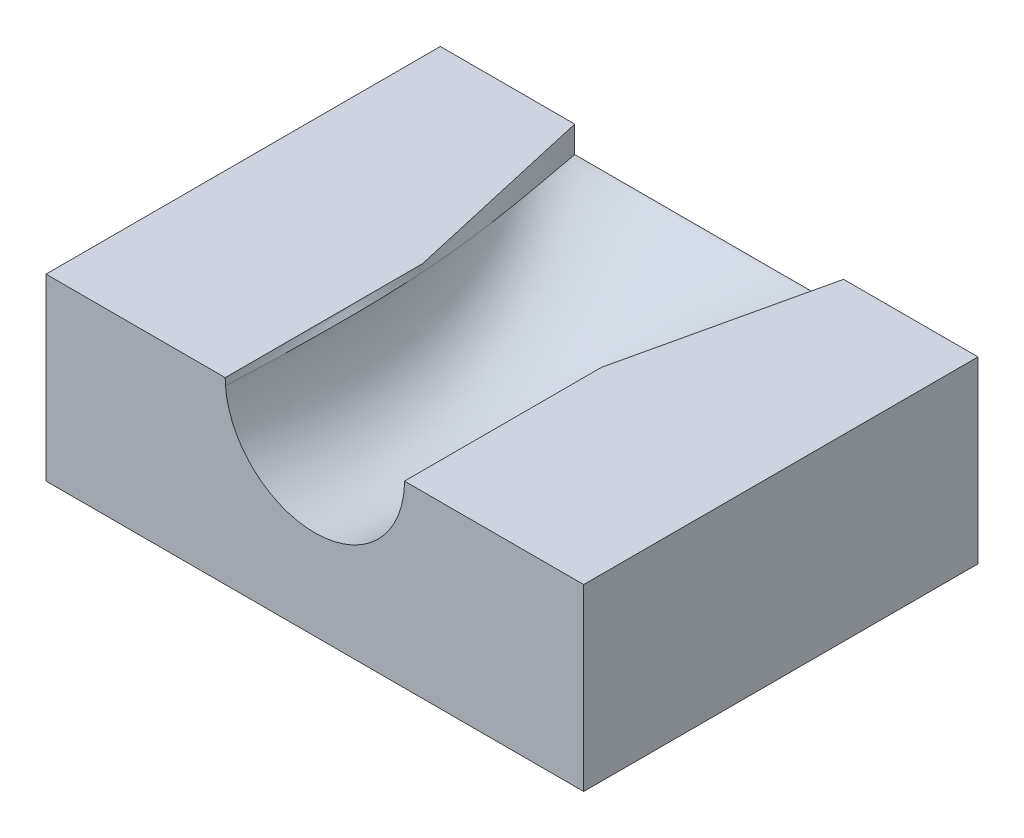
ISO-10303-21;
HEADER;
FILE_DESCRIPTION(('STEP AP214'),'2;1');
FILE_NAME('part.step','',(''),(''),'','','');
FILE_SCHEMA(('AUTOMOTIVE_DESIGN { 1 0 10303 214 1 1 1 1 }'));
ENDSEC;
DATA;
#1=APPLICATION_CONTEXT('core data for automotive mechanical design processes');
#2=APPLICATION_PROTOCOL_DEFINITION('international standard','automotive_design',2000,#1);
#3=PRODUCT_CONTEXT('',#1,'mechanical');
#4=PRODUCT('Part','Part','',(#3));
#5=PRODUCT_RELATED_PRODUCT_CATEGORY('part','',(#4));
#6=PRODUCT_DEFINITION_FORMATION('','',#4);
#7=PRODUCT_DEFINITION_CONTEXT('part definition',#1,'design');
#8=PRODUCT_DEFINITION('design','',#6,#7);
#9=PRODUCT_DEFINITION_SHAPE('','',#8);
#10=(LENGTH_UNIT() NAMED_UNIT(*) SI_UNIT(.MILLI.,.METRE.));
#11=(NAMED_UNIT(*) PLANE_ANGLE_UNIT() SI_UNIT($,.RADIAN.));
#12=(NAMED_UNIT(*) SI_UNIT($,.STERADIAN.) SOLID_ANGLE_UNIT());
#13=UNCERTAINTY_MEASURE_WITH_UNIT(LENGTH_MEASURE(1.E-05),#10,'distance_accuracy_value','');
#14=(GEOMETRIC_REPRESENTATION_CONTEXT(3) GLOBAL_UNCERTAINTY_ASSIGNED_CONTEXT((#13)) GLOBAL_UNIT_ASSIGNED_CONTEXT((#10,
#11,#12)) REPRESENTATION_CONTEXT('',''));
#15=CARTESIAN_POINT('',(0.,0.,0.));
#16=DIRECTION('',(0.,0.,1.));
#17=DIRECTION('',(1.,0.,0.));
#18=AXIS2_PLACEMENT_3D('',#15,#16,#17);
#19=CARTESIAN_POINT('',(-25.4,-25.4,27.94));
#20=DIRECTION('',(0.,0.,1.));
#21=DIRECTION('',(1.,0.,0.));
#22=AXIS2_PLACEMENT_3D('',#19,#20,#21);
#23=PLANE('',#22);
#24=DIRECTION('',(0.,-1.,0.));
#25=VECTOR('',#24,1.);
#26=CARTESIAN_POINT('',(-25.4,0.,27.94));
#27=LINE('',#26,#25);
#28=CARTESIAN_POINT('',(-25.4,0.,27.94));
#29=VERTEX_POINT('',#28);
#30=CARTESIAN_POINT('',(-25.4,-25.4,27.94));
#31=VERTEX_POINT('',#30);
#32=EDGE_CURVE('E171',#29,#31,#27,.T.);
#33=ORIENTED_EDGE('',*,*,#32,.F.);
#34=DIRECTION('',(-1.,0.,0.));
#35=VECTOR('',#34,1.);
#36=CARTESIAN_POINT('',(-25.4,0.,27.94));
#37=LINE('',#36,#35);
#38=CARTESIAN_POINT('',(-6.35,0.,27.94));
#39=VERTEX_POINT('',#38);
#40=EDGE_CURVE('E252',#39,#29,#37,.T.);
#41=ORIENTED_EDGE('',*,*,#40,.F.);
#42=DIRECTION('',(0.,1.,0.));
#43=VECTOR('',#42,1.);
#44=CARTESIAN_POINT('',(-6.35,0.,27.94));
#45=LINE('',#44,#43);
#46=CARTESIAN_POINT('',(-6.35,-3.73783334356403,27.94));
#47=VERTEX_POINT('',#46);
#48=EDGE_CURVE('E495',#47,#39,#45,.T.);
#49=ORIENTED_EDGE('',*,*,#48,.F.);
#50=DIRECTION('',(-1.,0.,0.));
#51=VECTOR('',#50,1.);
#52=CARTESIAN_POINT('',(-6.35,-3.73783334356403,27.94));
#53=LINE('',#52,#51);
#54=CARTESIAN_POINT('',(31.75,-3.73783334356403,27.94));
#55=VERTEX_POINT('',#54);
#56=EDGE_CURVE('E352',#55,#47,#53,.T.);
#57=ORIENTED_EDGE('',*,*,#56,.F.);
#58=DIRECTION('',(0.,-1.,0.));
#59=VECTOR('',#58,1.);
#60=CARTESIAN_POINT('',(31.75,-3.73783334356403,27.94));
#61=LINE('',#60,#59);
#62=CARTESIAN_POINT('',(31.75,0.,27.94));
#63=VERTEX_POINT('',#62);
#64=EDGE_CURVE('E366',#63,#55,#61,.T.);
#65=ORIENTED_EDGE('',*,*,#64,.F.);
#66=DIRECTION('',(-1.,0.,0.));
#67=VECTOR('',#66,1.);
#68=CARTESIAN_POINT('',(31.75,0.,27.94));
#69=LINE('',#68,#67);
#70=CARTESIAN_POINT('',(50.8,0.,27.94));
#71=VERTEX_POINT('',#70);
#72=EDGE_CURVE('E528',#71,#63,#69,.T.);
#73=ORIENTED_EDGE('',*,*,#72,.F.);
#74=DIRECTION('',(0.,1.,0.));
#75=VECTOR('',#74,1.);
#76=CARTESIAN_POINT('',(50.8,-25.4,27.94));
#77=LINE('',#76,#75);
#78=CARTESIAN_POINT('',(50.8,-25.4,27.94));
#79=VERTEX_POINT('',#78);
#80=EDGE_CURVE('E164',#79,#71,#77,.T.);
#81=ORIENTED_EDGE('',*,*,#80,.F.);
#82=DIRECTION('',(1.,0.,0.));
#83=VECTOR('',#82,1.);
#84=CARTESIAN_POINT('',(-25.4,-25.4,27.94));
#85=LINE('',#84,#83);
#86=EDGE_CURVE('E168',#31,#79,#85,.T.);
#87=ORIENTED_EDGE('',*,*,#86,.F.);
#88=EDGE_LOOP('',(#33,#41,#49,#57,#65,#73,#81,#87));
#89=FACE_BOUND('',#88,.T.);
#90=ADVANCED_FACE('F111',(#89),#23,.F.);
#91=CARTESIAN_POINT('',(12.7,0.,83.82));
#92=DIRECTION('',(0.,0.,1.));
#93=DIRECTION('',(1.,0.,0.));
#94=AXIS2_PLACEMENT_3D('',#91,#92,#93);
#95=PLANE('',#94);
#96=CARTESIAN_POINT('',(12.7,0.,83.82));
#97=DIRECTION('',(0.,0.,-1.));
#98=DIRECTION('',(1.,0.,0.));
#99=AXIS2_PLACEMENT_3D('',#96,#97,#98);
#100=CIRCLE('',#99,12.7);
#101=CARTESIAN_POINT('',(25.4,0.,83.82));
#102=VERTEX_POINT('',#101);
#103=CARTESIAN_POINT('',(25.2436419255583,-1.98671770601093,83.82));
#104=VERTEX_POINT('',#103);
#105=EDGE_CURVE('E131',#102,#104,#100,.T.);
#106=ORIENTED_EDGE('',*,*,#105,.T.);
#107=CARTESIAN_POINT('',(0.0391498615892744,-0.996430515743631,83.82));
#108=VERTEX_POINT('',#107);
#109=EDGE_CURVE('E469',#104,#108,#100,.T.);
#110=ORIENTED_EDGE('',*,*,#109,.T.);
#111=CARTESIAN_POINT('',(0.,0.,83.82));
#112=VERTEX_POINT('',#111);
#113=EDGE_CURVE('E309',#108,#112,#100,.T.);
#114=ORIENTED_EDGE('',*,*,#113,.T.);
#115=DIRECTION('',(-1.,0.,0.));
#116=VECTOR('',#115,1.);
#117=CARTESIAN_POINT('',(0.,0.,83.82));
#118=LINE('',#117,#116);
#119=CARTESIAN_POINT('',(-25.4,0.,83.82));
#120=VERTEX_POINT('',#119);
#121=EDGE_CURVE('E13',#112,#120,#118,.T.);
#122=ORIENTED_EDGE('',*,*,#121,.T.);
#123=DIRECTION('',(0.,-1.,0.));
#124=VECTOR('',#123,1.);
#125=CARTESIAN_POINT('',(-25.4,0.,83.82));
#126=LINE('',#125,#124);
#127=CARTESIAN_POINT('',(-25.4,-25.4,83.82));
#128=VERTEX_POINT('',#127);
#129=EDGE_CURVE('E122',#120,#128,#126,.T.);
#130=ORIENTED_EDGE('',*,*,#129,.T.);
#131=DIRECTION('',(1.,0.,0.));
#132=VECTOR('',#131,1.);
#133=CARTESIAN_POINT('',(-25.4,-25.4,83.82));
#134=LINE('',#133,#132);
#135=CARTESIAN_POINT('',(50.8,-25.4,83.82));
#136=VERTEX_POINT('',#135);
#137=EDGE_CURVE('E199',#128,#136,#134,.T.);
#138=ORIENTED_EDGE('',*,*,#137,.T.);
#139=DIRECTION('',(0.,1.,0.));
#140=VECTOR('',#139,1.);
#141=CARTESIAN_POINT('',(50.8,-25.4,83.82));
#142=LINE('',#141,#140);
#143=CARTESIAN_POINT('',(50.8,0.,83.82));
#144=VERTEX_POINT('',#143);
#145=EDGE_CURVE('E429',#136,#144,#142,.T.);
#146=ORIENTED_EDGE('',*,*,#145,.T.);
#147=DIRECTION('',(-1.,0.,0.));
#148=VECTOR('',#147,1.);
#149=CARTESIAN_POINT('',(50.8,0.,83.82));
#150=LINE('',#149,#148);
#151=EDGE_CURVE('E415',#144,#102,#150,.T.);
#152=ORIENTED_EDGE('',*,*,#151,.T.);
#153=EDGE_LOOP('',(#106,#110,#114,#122,#130,#138,#146,#152));
#154=FACE_BOUND('',#153,.T.);
#155=ADVANCED_FACE('F329',(#154),#95,.T.);
#156=CARTESIAN_POINT('',(25.2436419255583,-1.98671770601093,83.82));
#157=CARTESIAN_POINT('',(24.7217942455111,-1.84626806851848,74.4532548870848));
#158=CARTESIAN_POINT('',(24.1999465654639,-1.70581843102602,65.0865097741695));
#159=CARTESIAN_POINT('',(25.2428046432121,-1.98649236055766,55.8873789835776));
#160=CARTESIAN_POINT('',(25.2432231584177,-1.98660499938151,55.8836894779942));
#161=CARTESIAN_POINT('',(26.3143823083008,-2.27489585521936,46.4464205784919));
#162=CARTESIAN_POINT('',(29.0321911541504,-3.0063645993917,37.1932102892459));
#163=CARTESIAN_POINT('',(31.75,-3.73783334356403,27.94));
#164=CARTESIAN_POINT('',(25.2696479995084,-1.82252181721763,83.82));
#165=CARTESIAN_POINT('',(24.7925928230331,-1.69388571048627,74.4577058687166));
#166=CARTESIAN_POINT('',(24.3155376465579,-1.56524960375491,65.0954117374331));
#167=CARTESIAN_POINT('',(25.2689513371596,-1.82231542607063,55.886460649473));
#168=CARTESIAN_POINT('',(25.2694033178852,-1.82241859059298,55.8827751838818));
#169=CARTESIAN_POINT('',(26.4261081826934,-2.08646066263625,46.4558342482269));
#170=CARTESIAN_POINT('',(29.0880540913467,-2.75640394711831,37.1979171241135));
#171=CARTESIAN_POINT('',(31.75,-3.42634723160037,27.94));
#172=CARTESIAN_POINT('',(25.3152114436737,-1.49310867031271,83.82));
#173=CARTESIAN_POINT('',(24.9272240508749,-1.38801770535624,74.4666078319802));
#174=CARTESIAN_POINT('',(24.5392366580761,-1.28292674039977,65.1132156639604));
#175=CARTESIAN_POINT('',(25.3147951914567,-1.4929400563415,55.8846239812638));
#176=CARTESIAN_POINT('',(25.3153145180289,-1.49302433795946,55.880946595657));
#177=CARTESIAN_POINT('',(26.6441724800492,-1.70873699317905,46.4746615876969));
#178=CARTESIAN_POINT('',(29.1970862400246,-2.25605600042604,37.2073307938485));
#179=CARTESIAN_POINT('',(31.75,-2.80337500767303,27.94));
#180=CARTESIAN_POINT('',(25.3641046689634,-0.996686652853036,83.82));
#181=CARTESIAN_POINT('',(25.1081587931166,-0.926728742968917,74.4799607768758));
#182=CARTESIAN_POINT('',(24.8522129172698,-0.856770833084798,65.1399215537514));
#183=CARTESIAN_POINT('',(25.3641065287362,-0.996574408370288,55.8818689789502));
#184=CARTESIAN_POINT('',(25.3647281253055,-0.996630513724697,55.8782037133199));
#185=CARTESIAN_POINT('',(26.9550181582644,-1.14022807704488,46.5029025969021));
#186=CARTESIAN_POINT('',(29.3525090791322,-1.50457237441345,37.221451298451));
#187=CARTESIAN_POINT('',(31.75,-1.86891667178202,27.94));
#188=CARTESIAN_POINT('',(25.3934709131461,-0.498727828651121,83.82));
#189=CARTESIAN_POINT('',(25.2680003770333,-0.463779713019099,74.4933137217712));
#190=CARTESIAN_POINT('',(25.1425298409205,-0.428831597387077,65.1666274435424));
#191=CARTESIAN_POINT('',(25.3938883720443,-0.498671755890102,55.8791139766365));
#192=CARTESIAN_POINT('',(25.3946134946651,-0.498699783834572,55.8754608309827));
#193=CARTESIAN_POINT('',(27.2495503777436,-0.570435263863964,46.5311436061072));
#194=CARTESIAN_POINT('',(29.4997751888718,-0.752446799877487,37.2355718030536));
#195=CARTESIAN_POINT('',(31.75,-0.934458335891011,27.94));
#196=CARTESIAN_POINT('',(25.4,-0.166242611200983,83.82));
#197=CARTESIAN_POINT('',(25.3604664655544,-0.15459323945603,74.5022156850349));
#198=CARTESIAN_POINT('',(25.3209329311087,-0.142943867711078,65.1844313700696));
#199=CARTESIAN_POINT('',(25.4006928458237,-0.166223920280855,55.8772773084273));
#200=CARTESIAN_POINT('',(25.4014878251384,-0.166233262928906,55.8736322427579));
#201=CARTESIAN_POINT('',(27.4350041361835,-0.190145089333625,46.5499709455772));
#202=CARTESIAN_POINT('',(29.5925020680918,-0.250815600648648,37.2449854727886));
#203=CARTESIAN_POINT('',(31.75,-0.31148611196367,27.94));
#204=CARTESIAN_POINT('',(25.4,0.,83.82));
#205=CARTESIAN_POINT('',(25.4031731310579,0.,74.5066666666667));
#206=CARTESIAN_POINT('',(25.4063462621159,0.,65.1933333333333));
#207=CARTESIAN_POINT('',(25.4008301191829,0.,55.8763589743228));
#208=CARTESIAN_POINT('',(25.4016602368332,0.,55.8727179486456));
#209=CARTESIAN_POINT('',(27.5250037123864,0.,46.5593846153123));
#210=CARTESIAN_POINT('',(29.6375018561932,0.,37.2496923076561));
#211=CARTESIAN_POINT('',(31.75,0.,27.94));
#212=B_SPLINE_SURFACE_WITH_KNOTS('',3,3,((#156,#157,#158,#159,#160,#161,#162,#163),(#164,#165,
#166,#167,#168,#169,#170,#171),(#172,#173,#174,#175,#176,#177,#178,#179),(#180,#181,#182,#183,
#184,#185,#186,#187),(#188,#189,#190,#191,#192,#193,#194,#195),(#196,#197,#198,#199,#200,#201,
#202,#203),(#204,#205,#206,#207,#208,#209,#210,#211)),.UNSPECIFIED.,.F.,.F.,.F.,(4,1,1,1,4),(4,
2,2,4),(0.938118294418709,0.953588720814032,0.969059147209355,0.984529573604677,1.),(0.,
0.493506931644914,0.493704943914121,1.),.UNSPECIFIED.);
#213=CARTESIAN_POINT('',(25.4,0.,83.82));
#214=CARTESIAN_POINT('',(25.4031731310579,0.,74.5066666666667));
#215=CARTESIAN_POINT('',(25.4063462621159,0.,65.1933333333333));
#216=CARTESIAN_POINT('',(25.4008301191829,0.,55.8763589743228));
#217=CARTESIAN_POINT('',(25.4016602368332,0.,55.8727179486456));
#218=CARTESIAN_POINT('',(27.5250037123864,0.,46.5593846153123));
#219=CARTESIAN_POINT('',(29.6375018561932,0.,37.2496923076561));
#220=CARTESIAN_POINT('',(31.75,0.,27.94));
#221=B_SPLINE_CURVE_WITH_KNOTS('',3,(#213,#214,#215,#216,#217,#218,#219,#220),.UNSPECIFIED.,.F.,
.F.,(4,2,2,4),(0.,0.493506931644914,0.493704943914121,1.),.UNSPECIFIED.);
#222=EDGE_CURVE('E394',#102,#63,#221,.T.);
#223=CARTESIAN_POINT('',(25.2436419255583,-1.98671770601093,83.82));
#224=CARTESIAN_POINT('',(24.7217942455111,-1.84626806851848,74.4532548870848));
#225=CARTESIAN_POINT('',(24.1999465654639,-1.70581843102602,65.0865097741695));
#226=CARTESIAN_POINT('',(25.2428046432121,-1.98649236055766,55.8873789835776));
#227=CARTESIAN_POINT('',(25.2432231584177,-1.98660499938151,55.8836894779942));
#228=CARTESIAN_POINT('',(26.3143823083008,-2.27489585521936,46.4464205784919));
#229=CARTESIAN_POINT('',(29.0321911541504,-3.0063645993917,37.1932102892459));
#230=CARTESIAN_POINT('',(31.75,-3.73783334356403,27.94));
#231=B_SPLINE_CURVE_WITH_KNOTS('',3,(#223,#224,#225,#226,#227,#228,#229,#230),.UNSPECIFIED.,.F.,
.F.,(4,2,2,4),(0.,0.493506931644914,0.493704943914121,1.),.UNSPECIFIED.);
#232=EDGE_CURVE('E401',#104,#55,#231,.T.);
#233=ORIENTED_EDGE('',*,*,#105,.F.);
#234=ORIENTED_EDGE('',*,*,#222,.T.);
#235=ORIENTED_EDGE('',*,*,#64,.T.);
#236=ORIENTED_EDGE('',*,*,#232,.F.);
#237=EDGE_LOOP('',(#233,#234,#235,#236));
#238=FACE_BOUND('',#237,.T.);
#239=ADVANCED_FACE('F372',(#238),#212,.T.);
#240=CARTESIAN_POINT('',(0.0391498615892744,-0.996430515743631,83.82));
#241=CARTESIAN_POINT('',(0.551596762696879,-0.776554098029622,74.4532548870848));
#242=CARTESIAN_POINT('',(1.06404366380448,-0.556677680315613,65.0865097741695));
#243=CARTESIAN_POINT('',(0.0399720607865443,-0.996077733409003,55.8873789835776));
#244=CARTESIAN_POINT('',(0.0395610848861714,-0.996254071500902,55.8836894779942));
#245=CARTESIAN_POINT('',(-1.01230176310234,-1.44757855886199,46.4464205784919));
#246=CARTESIAN_POINT('',(-3.68115088155117,-2.59270595121301,37.1932102892459));
#247=CARTESIAN_POINT('',(-6.35,-3.73783334356403,27.94));
#248=CARTESIAN_POINT('',(0.159799876275896,-2.52943430377433,83.82));
#249=CARTESIAN_POINT('',(0.554596895059939,-2.43251368731416,74.4532548870848));
#250=CARTESIAN_POINT('',(0.949393913843982,-2.33559307085399,65.0865097741695));
#251=CARTESIAN_POINT('',(0.160433311254675,-2.52927879877883,55.8873789835776));
#252=CARTESIAN_POINT('',(0.16011668906434,-2.52935652788115,55.8836894779942));
#253=CARTESIAN_POINT('',(-0.650254718505863,-2.72829849716275,46.4464205784919));
#254=CARTESIAN_POINT('',(-2.70637735925293,-3.23306592036339,37.1932102892459));
#255=CARTESIAN_POINT('',(-4.7625,-3.73783334356403,27.94));
#256=CARTESIAN_POINT('',(0.963484239614055,-5.5508265044219,83.8200000000003));
#257=CARTESIAN_POINT('',(1.16808798137688,-5.6962390784165,74.4532548870849));
#258=CARTESIAN_POINT('',(1.37269172313971,-5.84165165241109,65.0865097741695));
#259=CARTESIAN_POINT('',(0.963812517591503,-5.55105981269512,55.8873789835775));
#260=CARTESIAN_POINT('',(0.963648427991568,-5.55094319365928,55.8836894779942));
#261=CARTESIAN_POINT('',(0.543673062632586,-5.25246527548923,46.4464205784918));
#262=CARTESIAN_POINT('',(-0.521913468683705,-4.49514930952663,37.1932102892459));
#263=CARTESIAN_POINT('',(-1.5875,-3.73783334356404,27.94));
#264=CARTESIAN_POINT('',(3.70199935855768,-9.35865154536493,83.8199999999996));
#265=CARTESIAN_POINT('',(3.74426776578381,-9.80947378801077,74.4532548870845));
#266=CARTESIAN_POINT('',(3.78653617300995,-10.2602960306566,65.0865097741695));
#267=CARTESIAN_POINT('',(3.70206717641432,-9.35937487042594,55.8873789835776));
#268=CARTESIAN_POINT('',(3.70203327768905,-9.35901331671827,55.8836894779942));
#269=CARTESIAN_POINT('',(3.61527196230448,-8.43364296700772,46.446420578492));
#270=CARTESIAN_POINT('',(3.39513598115224,-6.08573815528588,37.193210289246));
#271=CARTESIAN_POINT('',(3.17500000000001,-3.73783334356404,27.94));
#272=CARTESIAN_POINT('',(7.61417757813304,-11.9450890017901,83.8200000000004));
#273=CARTESIAN_POINT('',(7.58824524335711,-12.6033585399551,74.4532548870849));
#274=CARTESIAN_POINT('',(7.56231290858119,-13.2616280781202,65.0865097741695));
#275=CARTESIAN_POINT('',(7.6141359708079,-11.9461451671893,55.8873789835775));
#276=CARTESIAN_POINT('',(7.61415676821074,-11.9456172433877,55.8836894779941));
#277=CARTESIAN_POINT('',(7.66738620418439,-10.5944347703123,46.4464205784918));
#278=CARTESIAN_POINT('',(7.8024431020922,-7.16613405693816,37.1932102892459));
#279=CARTESIAN_POINT('',(7.93750000000001,-3.73783334356403,27.94));
#280=CARTESIAN_POINT('',(12.19030144725,-12.9726944406285,83.8199999999999));
#281=CARTESIAN_POINT('',(12.1494206650623,-13.7133838991432,74.4532548870847));
#282=CARTESIAN_POINT('',(12.1085398828747,-14.4540733576579,65.0865097741695));
#283=CARTESIAN_POINT('',(12.1902358557784,-12.9738828452747,55.8873789835777));
#284=CARTESIAN_POINT('',(12.1902686416461,-12.9732888217447,55.8836894779943));
#285=CARTESIAN_POINT('',(12.2741816790494,-11.4529289139682,46.446420578492));
#286=CARTESIAN_POINT('',(12.4870908395247,-7.59538112876609,37.193210289246));
#287=CARTESIAN_POINT('',(12.7,-3.73783334356403,27.94));
#288=CARTESIAN_POINT('',(16.8329436471787,-12.3072953071215,83.82));
#289=CARTESIAN_POINT('',(16.7824495737785,-12.9946158931959,74.4532548870847));
#290=CARTESIAN_POINT('',(16.7319555003783,-13.6819364792703,65.0865097741693));
#291=CARTESIAN_POINT('',(16.8328626315915,-12.3083980836881,55.8873789835774));
#292=CARTESIAN_POINT('',(16.8329031271964,-12.3078468613154,55.883689477994));
#293=CARTESIAN_POINT('',(16.9365486751322,-10.8970333944241,46.4464205784917));
#294=CARTESIAN_POINT('',(17.1995243375661,-7.31743336899407,37.1932102892459));
#295=CARTESIAN_POINT('',(17.4625,-3.73783334356403,27.94));
#296=CARTESIAN_POINT('',(20.9359914709144,-10.0357769396288,83.8199999999998));
#297=CARTESIAN_POINT('',(20.8326055055605,-10.5409085688861,74.4532548870848));
#298=CARTESIAN_POINT('',(20.7292195402066,-11.0460401981434,65.0865097741696));
#299=CARTESIAN_POINT('',(20.9358255925423,-10.0365874017843,55.8873789835778));
#300=CARTESIAN_POINT('',(20.9359085067723,-10.036182292639,55.8836894779944));
#301=CARTESIAN_POINT('',(21.1481214321001,-8.99933497633891,46.4464205784921));
#302=CARTESIAN_POINT('',(21.68656071605,-6.36858415995148,37.193210289246));
#303=CARTESIAN_POINT('',(22.225,-3.73783334356404,27.94));
#304=CARTESIAN_POINT('',(23.9648231710816,-6.45455157235893,83.8200000000001));
#305=CARTESIAN_POINT('',(23.7223869459837,-6.6724481419633,74.4532548870847));
#306=CARTESIAN_POINT('',(23.4799507208857,-6.89034471156767,65.0865097741693));
#307=CARTESIAN_POINT('',(23.9644341924983,-6.45490117811172,55.8873789835774));
#308=CARTESIAN_POINT('',(23.9646286232689,-6.45472642783283,55.883689477994));
#309=CARTESIAN_POINT('',(24.4622600025122,-6.00746583209973,46.4464205784917));
#310=CARTESIAN_POINT('',(25.7248800012561,-4.87264958783188,37.1932102892458));
#311=CARTESIAN_POINT('',(26.9875,-3.73783334356403,27.94));
#312=CARTESIAN_POINT('',(25.0030857436458,-3.50552966392542,83.82));
#313=CARTESIAN_POINT('',(24.5892707753831,-3.48689756054303,74.4532548870848));
#314=CARTESIAN_POINT('',(24.1754558071204,-3.46826545716064,65.0865097741695));
#315=CARTESIAN_POINT('',(25.0024217951782,-3.50549976951019,55.8873789835776));
#316=CARTESIAN_POINT('',(25.0027536695222,-3.50551471222024,55.8836894779942));
#317=CARTESIAN_POINT('',(25.8521618523335,-3.54375948896776,46.4464205784919));
#318=CARTESIAN_POINT('',(28.0073309261667,-3.6407964162659,37.1932102892459));
#319=CARTESIAN_POINT('',(30.1625,-3.73783334356403,27.94));
#320=CARTESIAN_POINT('',(25.2436419255583,-1.98671770601093,83.82));
#321=CARTESIAN_POINT('',(24.7217942455111,-1.84626806851848,74.4532548870848));
#322=CARTESIAN_POINT('',(24.1999465654639,-1.70581843102602,65.0865097741695));
#323=CARTESIAN_POINT('',(25.2428046432121,-1.98649236055766,55.8873789835776));
#324=CARTESIAN_POINT('',(25.2432231584177,-1.98660499938151,55.8836894779942));
#325=CARTESIAN_POINT('',(26.3143823083008,-2.27489585521936,46.4464205784919));
#326=CARTESIAN_POINT('',(29.0321911541504,-3.0063645993917,37.1932102892459));
#327=CARTESIAN_POINT('',(31.75,-3.73783334356403,27.94));
#328=B_SPLINE_SURFACE_WITH_KNOTS('',3,3,((#240,#241,#242,#243,#244,#245,#246,#247),(#248,#249,
#250,#251,#252,#253,#254,#255),(#256,#257,#258,#259,#260,#261,#262,#263),(#264,#265,#266,#267,
#268,#269,#270,#271),(#272,#273,#274,#275,#276,#277,#278,#279),(#280,#281,#282,#283,#284,#285,
#286,#287),(#288,#289,#290,#291,#292,#293,#294,#295),(#296,#297,#298,#299,#300,#301,#302,#303),
(#304,#305,#306,#307,#308,#309,#310,#311),(#312,#313,#314,#315,#316,#317,#318,#319),(#320,#321,
#322,#323,#324,#325,#326,#327)),.UNSPECIFIED.,.F.,.F.,.F.,(4,1,1,1,1,1,1,1,4),(4,2,2,4),
(0.0461602883891132,0.157655039142813,0.269149789896512,0.380644540650212,0.492139291403911,
0.603634042157611,0.71512879291131,0.82662354366501,0.938118294418709),(0.,0.493506931644914,
0.493704943914121,1.),.UNSPECIFIED.);
#329=CARTESIAN_POINT('',(0.0391498615892744,-0.996430515743631,83.82));
#330=CARTESIAN_POINT('',(0.551596762696879,-0.776554098029622,74.4532548870848));
#331=CARTESIAN_POINT('',(1.06404366380448,-0.556677680315613,65.0865097741695));
#332=CARTESIAN_POINT('',(0.0399720607865443,-0.996077733409003,55.8873789835776));
#333=CARTESIAN_POINT('',(0.0395610848861714,-0.996254071500902,55.8836894779942));
#334=CARTESIAN_POINT('',(-1.01230176310234,-1.44757855886199,46.4464205784919));
#335=CARTESIAN_POINT('',(-3.68115088155117,-2.59270595121301,37.1932102892459));
#336=CARTESIAN_POINT('',(-6.35,-3.73783334356403,27.94));
#337=B_SPLINE_CURVE_WITH_KNOTS('',3,(#329,#330,#331,#332,#333,#334,#335,#336),.UNSPECIFIED.,.F.,
.F.,(4,2,2,4),(0.,0.493506931644914,0.493704943914121,1.),.UNSPECIFIED.);
#338=EDGE_CURVE('E294',#108,#47,#337,.T.);
#339=ORIENTED_EDGE('',*,*,#109,.F.);
#340=ORIENTED_EDGE('',*,*,#232,.T.);
#341=ORIENTED_EDGE('',*,*,#56,.T.);
#342=ORIENTED_EDGE('',*,*,#338,.F.);
#343=EDGE_LOOP('',(#339,#340,#341,#342));
#344=FACE_BOUND('',#343,.T.);
#345=ADVANCED_FACE('F328',(#344),#328,.T.);
#346=CARTESIAN_POINT('',(0.,0.,83.82));
#347=CARTESIAN_POINT('',(0.,0.,74.510402003511));
#348=CARTESIAN_POINT('',(0.,0.,65.2008040070219));
#349=CARTESIAN_POINT('',(0.000817161127187075,0.,55.8873789835776));
#350=CARTESIAN_POINT('',(0.000408703503887793,0.,55.8836894779942));
#351=CARTESIAN_POINT('',(-2.11666666666667,0.,46.5666666666667));
#352=CARTESIAN_POINT('',(-4.23333333333333,0.,37.2533333333333));
#353=CARTESIAN_POINT('',(-6.35,0.,27.94));
#354=CARTESIAN_POINT('',(0.,-0.0831213056246213,83.82));
#355=CARTESIAN_POINT('',(0.0424422379154057,-0.0648051227418214,74.5056397438088));
#356=CARTESIAN_POINT('',(0.0848844758308146,-0.0464889398590215,65.1912794876176));
#357=CARTESIAN_POINT('',(0.000817161127187075,-0.0830919180903598,55.8873789835776));
#358=CARTESIAN_POINT('',(0.000408703503887793,-0.0831066074361932,55.8836894779942));
#359=CARTESIAN_POINT('',(-2.02736184427374,-0.12070291692648,46.5566461593188));
#360=CARTESIAN_POINT('',(-4.18868092213687,-0.216094514445075,37.2483230796594));
#361=CARTESIAN_POINT('',(-6.35,-0.31148611196367,27.94));
#362=CARTESIAN_POINT('',(0.00163213018488778,-0.249363916719372,83.82));
#363=CARTESIAN_POINT('',(0.129089750244717,-0.194415368058582,74.4961152244044));
#364=CARTESIAN_POINT('',(0.25654737030455,-0.139466819397791,65.1722304488089));
#365=CARTESIAN_POINT('',(0.00244950134567197,-0.249275754116568,55.8873789835776));
#366=CARTESIAN_POINT('',(0.00204093873717328,-0.249319822154078,55.8836894779943));
#367=CARTESIAN_POINT('',(-1.8473886662168,-0.362108750650375,46.536605144623));
#368=CARTESIAN_POINT('',(-4.0986943331084,-0.648283543270692,37.2383025723115));
#369=CARTESIAN_POINT('',(-6.35,-0.934458335891009,27.94));
#370=CARTESIAN_POINT('',(0.00897580064337474,-0.498631698829648,83.82));
#371=CARTESIAN_POINT('',(0.264349139442385,-0.388726890954457,74.4818284452979));
#372=CARTESIAN_POINT('',(0.519722478241398,-0.278822083079266,65.1436568905957));
#373=CARTESIAN_POINT('',(0.00979411683754955,-0.498455361252784,55.8873789835776));
#374=CARTESIAN_POINT('',(0.00938508185453404,-0.49854350351157,55.8836894779942));
#375=CARTESIAN_POINT('',(-1.57333906405014,-0.724137187402249,46.5065436225793));
#376=CARTESIAN_POINT('',(-3.96166953202507,-1.29652692959213,37.2232718112896));
#377=CARTESIAN_POINT('',(-6.35,-1.86891667178202,27.94));
#378=CARTESIAN_POINT('',(0.0212120930485425,-0.747707249300088,83.82));
#379=CARTESIAN_POINT('',(0.404893567263317,-0.582830764117283,74.4675416661913));
#380=CARTESIAN_POINT('',(0.788575041478093,-0.417954278934479,65.1150833323826));
#381=CARTESIAN_POINT('',(0.0220319838919292,-0.747442712011493,55.8873789835776));
#382=CARTESIAN_POINT('',(0.0216221618212108,-0.74757494085667,55.8836894779942));
#383=CARTESIAN_POINT('',(-1.29520201048474,-1.08600502775128,46.4764821005356));
#384=CARTESIAN_POINT('',(-3.82260100524237,-1.94469001771215,37.2082410502678));
#385=CARTESIAN_POINT('',(-6.35,-2.80337500767303,27.94));
#386=CARTESIAN_POINT('',(0.0326282391142487,-0.913565445363917,83.82));
#387=CARTESIAN_POINT('',(0.502109830332876,-0.712025762086522,74.4580171467869));
#388=CARTESIAN_POINT('',(0.971591421551504,-0.510486078809127,65.0960342935739));
#389=CARTESIAN_POINT('',(0.0334495990648459,-0.913242083537642,55.8873789835776));
#390=CARTESIAN_POINT('',(0.0330390426615464,-0.913403715801622,55.8836894779942));
#391=CARTESIAN_POINT('',(-1.10705495555087,-1.32708970897801,46.4564410858398));
#392=CARTESIAN_POINT('',(-3.72852747777543,-2.37671847028919,37.1982205429199));
#393=CARTESIAN_POINT('',(-6.35,-3.42634723160036,27.94));
#394=CARTESIAN_POINT('',(0.0391498615892744,-0.996430515743631,83.82));
#395=CARTESIAN_POINT('',(0.551596762696879,-0.776554098029622,74.4532548870848));
#396=CARTESIAN_POINT('',(1.06404366380448,-0.556677680315613,65.0865097741695));
#397=CARTESIAN_POINT('',(0.0399720607865443,-0.996077733409003,55.8873789835776));
#398=CARTESIAN_POINT('',(0.0395610848861714,-0.996254071500902,55.8836894779942));
#399=CARTESIAN_POINT('',(-1.01230176310234,-1.44757855886199,46.4464205784919));
#400=CARTESIAN_POINT('',(-3.68115088155117,-2.59270595121301,37.1932102892459));
#401=CARTESIAN_POINT('',(-6.35,-3.73783334356403,27.94));
#402=B_SPLINE_SURFACE_WITH_KNOTS('',3,3,((#346,#347,#348,#349,#350,#351,#352,#353),(#354,#355,
#356,#357,#358,#359,#360,#361),(#362,#363,#364,#365,#366,#367,#368,#369),(#370,#371,#372,#373,
#374,#375,#376,#377),(#378,#379,#380,#381,#382,#383,#384,#385),(#386,#387,#388,#389,#390,#391,
#392,#393),(#394,#395,#396,#397,#398,#399,#400,#401)),.UNSPECIFIED.,.F.,.F.,.F.,(4,1,1,1,4),(4,
2,2,4),(0.,0.0115400720972783,0.0230801441945566,0.0346202162918349,0.0461602883891132),(0.,
0.493506931644914,0.493704943914121,1.),.UNSPECIFIED.);
#403=CARTESIAN_POINT('',(0.,0.,83.82));
#404=CARTESIAN_POINT('',(0.,0.,74.510402003511));
#405=CARTESIAN_POINT('',(0.,0.,65.2008040070219));
#406=CARTESIAN_POINT('',(0.000817161127187075,0.,55.8873789835776));
#407=CARTESIAN_POINT('',(0.000408703503887793,0.,55.8836894779942));
#408=CARTESIAN_POINT('',(-2.11666666666667,0.,46.5666666666667));
#409=CARTESIAN_POINT('',(-4.23333333333333,0.,37.2533333333333));
#410=CARTESIAN_POINT('',(-6.35,0.,27.94));
#411=B_SPLINE_CURVE_WITH_KNOTS('',3,(#403,#404,#405,#406,#407,#408,#409,#410),.UNSPECIFIED.,.F.,
.F.,(4,2,2,4),(0.,0.493506931644914,0.493704943914121,1.),.UNSPECIFIED.);
#412=EDGE_CURVE('E287',#112,#39,#411,.T.);
#413=ORIENTED_EDGE('',*,*,#113,.F.);
#414=ORIENTED_EDGE('',*,*,#338,.T.);
#415=ORIENTED_EDGE('',*,*,#48,.T.);
#416=ORIENTED_EDGE('',*,*,#412,.F.);
#417=EDGE_LOOP('',(#413,#414,#415,#416));
#418=FACE_BOUND('',#417,.T.);
#419=ADVANCED_FACE('F316',(#418),#402,.T.);
#420=CARTESIAN_POINT('',(25.4,0.,83.82));
#421=DIRECTION('',(0.,1.,0.));
#422=DIRECTION('',(1.,0.,0.));
#423=AXIS2_PLACEMENT_3D('',#420,#421,#422);
#424=PLANE('',#423);
#425=ORIENTED_EDGE('',*,*,#151,.F.);
#426=CARTESIAN_POINT('',(50.8,0.,83.82));
#427=DIRECTION('',(0.,0.,-1.));
#428=VECTOR('',#427,1.);
#429=LINE('',#426,#428);
#430=EDGE_CURVE('E295',#144,#71,#429,.T.);
#431=ORIENTED_EDGE('',*,*,#430,.T.);
#432=ORIENTED_EDGE('',*,*,#72,.T.);
#433=ORIENTED_EDGE('',*,*,#222,.F.);
#434=EDGE_LOOP('',(#425,#431,#432,#433));
#435=FACE_BOUND('',#434,.T.);
#436=ADVANCED_FACE('F267',(#435),#424,.T.);
#437=CARTESIAN_POINT('',(-25.4,0.,83.82));
#438=DIRECTION('',(0.,1.,0.));
#439=DIRECTION('',(1.,0.,0.));
#440=AXIS2_PLACEMENT_3D('',#437,#438,#439);
#441=PLANE('',#440);
#442=ORIENTED_EDGE('',*,*,#121,.F.);
#443=ORIENTED_EDGE('',*,*,#412,.T.);
#444=ORIENTED_EDGE('',*,*,#40,.T.);
#445=CARTESIAN_POINT('',(-25.4,0.,27.94));
#446=DIRECTION('',(0.,0.,1.));
#447=VECTOR('',#446,1.);
#448=LINE('',#445,#447);
#449=CARTESIAN_POINT('',(-25.4,0.,55.88));
#450=VERTEX_POINT('',#449);
#451=EDGE_CURVE('E189',#29,#450,#448,.T.);
#452=ORIENTED_EDGE('',*,*,#451,.T.);
#453=CARTESIAN_POINT('',(-25.4,0.,55.88));
#454=DIRECTION('',(0.,0.,1.));
#455=VECTOR('',#454,1.);
#456=LINE('',#453,#455);
#457=EDGE_CURVE('E202',#450,#120,#456,.T.);
#458=ORIENTED_EDGE('',*,*,#457,.T.);
#459=EDGE_LOOP('',(#442,#443,#444,#452,#458));
#460=FACE_BOUND('',#459,.T.);
#461=ADVANCED_FACE('F258',(#460),#441,.T.);
#462=CARTESIAN_POINT('',(50.8,12.7,27.94));
#463=DIRECTION('',(1.,0.,0.));
#464=DIRECTION('',(0.,0.,-1.));
#465=AXIS2_PLACEMENT_3D('',#462,#463,#464);
#466=PLANE('',#465);
#467=CARTESIAN_POINT('',(50.8,-25.4,83.82));
#468=DIRECTION('',(0.,0.,-1.));
#469=VECTOR('',#468,1.);
#470=LINE('',#467,#469);
#471=EDGE_CURVE('E201',#136,#79,#470,.T.);
#472=ORIENTED_EDGE('',*,*,#471,.T.);
#473=ORIENTED_EDGE('',*,*,#80,.T.);
#474=ORIENTED_EDGE('',*,*,#430,.F.);
#475=ORIENTED_EDGE('',*,*,#145,.F.);
#476=EDGE_LOOP('',(#472,#473,#474,#475));
#477=FACE_BOUND('',#476,.T.);
#478=ADVANCED_FACE('F220',(#477),#466,.T.);
#479=CARTESIAN_POINT('',(88.9,-25.4,27.94));
#480=DIRECTION('',(0.,-1.,0.));
#481=DIRECTION('',(0.,0.,-1.));
#482=AXIS2_PLACEMENT_3D('',#479,#480,#481);
#483=PLANE('',#482);
#484=CARTESIAN_POINT('',(-25.4,-25.4,83.82));
#485=DIRECTION('',(0.,0.,-1.));
#486=VECTOR('',#485,1.);
#487=LINE('',#484,#486);
#488=EDGE_CURVE('E186',#128,#31,#487,.T.);
#489=ORIENTED_EDGE('',*,*,#488,.T.);
#490=ORIENTED_EDGE('',*,*,#86,.T.);
#491=ORIENTED_EDGE('',*,*,#471,.F.);
#492=ORIENTED_EDGE('',*,*,#137,.F.);
#493=EDGE_LOOP('',(#489,#490,#491,#492));
#494=FACE_BOUND('',#493,.T.);
#495=ADVANCED_FACE('F197',(#494),#483,.T.);
#496=CARTESIAN_POINT('',(-25.4,-38.1,27.94));
#497=DIRECTION('',(-1.,0.,0.));
#498=DIRECTION('',(0.,-1.,0.));
#499=AXIS2_PLACEMENT_3D('',#496,#497,#498);
#500=PLANE('',#499);
#501=ORIENTED_EDGE('',*,*,#32,.T.);
#502=ORIENTED_EDGE('',*,*,#488,.F.);
#503=ORIENTED_EDGE('',*,*,#129,.F.);
#504=ORIENTED_EDGE('',*,*,#457,.F.);
#505=ORIENTED_EDGE('',*,*,#451,.F.);
#506=EDGE_LOOP('',(#501,#502,#503,#504,#505));
#507=FACE_BOUND('',#506,.T.);
#508=ADVANCED_FACE('F183',(#507),#500,.T.);
#509=CLOSED_SHELL('',(#90,#155,#239,#345,#419,#436,#461,#478,#495,#508));
#510=MANIFOLD_SOLID_BREP('B2',#509);
#511=ADVANCED_BREP_SHAPE_REPRESENTATION('',(#18,#510),#14);
#512=SHAPE_DEFINITION_REPRESENTATION(#9,#511);
ENDSEC;
END-ISO-10303-21;
